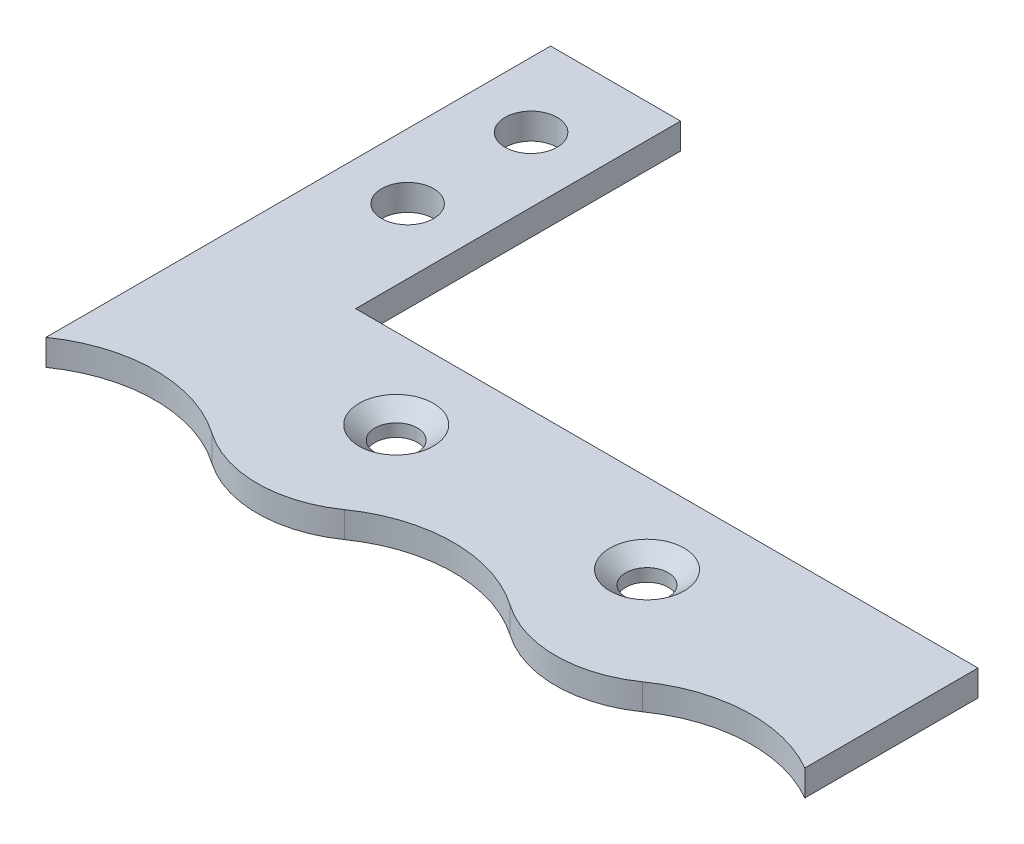
ISO-10303-21;
HEADER;
FILE_DESCRIPTION(('STEP AP214'),'2;1');
FILE_NAME('part.step','',(''),(''),'','','');
FILE_SCHEMA(('AUTOMOTIVE_DESIGN { 1 0 10303 214 1 1 1 1 }'));
ENDSEC;
DATA;
#1=APPLICATION_CONTEXT('core data for automotive mechanical design processes');
#2=APPLICATION_PROTOCOL_DEFINITION('international standard','automotive_design',2000,#1);
#3=PRODUCT_CONTEXT('',#1,'mechanical');
#4=PRODUCT('Part','Part','',(#3));
#5=PRODUCT_RELATED_PRODUCT_CATEGORY('part','',(#4));
#6=PRODUCT_DEFINITION_FORMATION('','',#4);
#7=PRODUCT_DEFINITION_CONTEXT('part definition',#1,'design');
#8=PRODUCT_DEFINITION('design','',#6,#7);
#9=PRODUCT_DEFINITION_SHAPE('','',#8);
#10=(LENGTH_UNIT() NAMED_UNIT(*) SI_UNIT(.MILLI.,.METRE.));
#11=(NAMED_UNIT(*) PLANE_ANGLE_UNIT() SI_UNIT($,.RADIAN.));
#12=(NAMED_UNIT(*) SI_UNIT($,.STERADIAN.) SOLID_ANGLE_UNIT());
#13=UNCERTAINTY_MEASURE_WITH_UNIT(LENGTH_MEASURE(1.E-05),#10,'distance_accuracy_value','');
#14=(GEOMETRIC_REPRESENTATION_CONTEXT(3) GLOBAL_UNCERTAINTY_ASSIGNED_CONTEXT((#13)) GLOBAL_UNIT_ASSIGNED_CONTEXT((#10,
#11,#12)) REPRESENTATION_CONTEXT('',''));
#15=CARTESIAN_POINT('',(0.,0.,0.));
#16=DIRECTION('',(0.,0.,1.));
#17=DIRECTION('',(1.,0.,0.));
#18=AXIS2_PLACEMENT_3D('',#15,#16,#17);
#19=CARTESIAN_POINT('',(-22.95,1.,0.));
#20=DIRECTION('',(0.,-1.,0.));
#21=DIRECTION('',(0.,0.,-1.));
#22=AXIS2_PLACEMENT_3D('',#19,#20,#21);
#23=PLANE('',#22);
#24=CARTESIAN_POINT('',(9.25666666666667,1.,-16.7627844561292));
#25=DIRECTION('',(0.,-1.,0.));
#26=DIRECTION('',(0.,0.,-1.));
#27=AXIS2_PLACEMENT_3D('',#24,#25,#26);
#28=CIRCLE('',#27,1.63195);
#29=CARTESIAN_POINT('',(9.25666666666667,1.,-18.3947344561292));
#30=VERTEX_POINT('',#29);
#31=EDGE_CURVE('E379',#30,#30,#28,.F.);
#32=ORIENTED_EDGE('',*,*,#31,.T.);
#33=EDGE_LOOP('',(#32));
#34=FACE_BOUND('',#33,.T.);
#35=CARTESIAN_POINT('',(-24.33,1.,-41.4327844561292));
#36=DIRECTION('',(0.,-1.,0.));
#37=DIRECTION('',(0.,0.,-1.));
#38=AXIS2_PLACEMENT_3D('',#35,#36,#37);
#39=CIRCLE('',#38,2.00000000000001);
#40=CARTESIAN_POINT('',(-24.33,1.,-43.4327844561293));
#41=VERTEX_POINT('',#40);
#42=EDGE_CURVE('E118',#41,#41,#39,.F.);
#43=ORIENTED_EDGE('',*,*,#42,.T.);
#44=EDGE_LOOP('',(#43));
#45=FACE_BOUND('',#44,.T.);
#46=CARTESIAN_POINT('',(-24.33,1.,-31.9327844561292));
#47=DIRECTION('',(0.,-1.,0.));
#48=DIRECTION('',(0.,0.,-1.));
#49=AXIS2_PLACEMENT_3D('',#46,#47,#48);
#50=CIRCLE('',#49,2.00000000000001);
#51=CARTESIAN_POINT('',(-24.33,1.,-33.9327844561292));
#52=VERTEX_POINT('',#51);
#53=EDGE_CURVE('E378',#52,#52,#50,.F.);
#54=ORIENTED_EDGE('',*,*,#53,.T.);
#55=EDGE_LOOP('',(#54));
#56=FACE_BOUND('',#55,.T.);
#57=CARTESIAN_POINT('',(-22.95,1.,0.));
#58=DIRECTION('',(0.,-1.,0.));
#59=DIRECTION('',(0.,0.,-1.));
#60=AXIS2_PLACEMENT_3D('',#57,#58,#59);
#61=CIRCLE('',#60,11.125);
#62=CARTESIAN_POINT('',(-29.33,1.,-9.11379311812595));
#63=VERTEX_POINT('',#62);
#64=CARTESIAN_POINT('',(-16.57,1.,-9.11379311812595));
#65=VERTEX_POINT('',#64);
#66=EDGE_CURVE('E113',#63,#65,#61,.T.);
#67=ORIENTED_EDGE('',*,*,#66,.F.);
#68=DIRECTION('',(0.,0.,-1.));
#69=VECTOR('',#68,1.);
#70=CARTESIAN_POINT('',(-29.33,1.,0.));
#71=LINE('',#70,#69);
#72=CARTESIAN_POINT('',(-29.33,1.,-47.9327844561292));
#73=VERTEX_POINT('',#72);
#74=EDGE_CURVE('E126',#73,#63,#71,.F.);
#75=ORIENTED_EDGE('',*,*,#74,.F.);
#76=DIRECTION('',(1.,0.,0.));
#77=VECTOR('',#76,1.);
#78=CARTESIAN_POINT('',(-22.95,1.,-47.9327844561292));
#79=LINE('',#78,#77);
#80=CARTESIAN_POINT('',(-19.33,1.,-47.9327844561292));
#81=VERTEX_POINT('',#80);
#82=EDGE_CURVE('E129',#81,#73,#79,.F.);
#83=ORIENTED_EDGE('',*,*,#82,.F.);
#84=DIRECTION('',(0.,0.,-1.));
#85=VECTOR('',#84,1.);
#86=CARTESIAN_POINT('',(-19.33,1.,0.));
#87=LINE('',#86,#85);
#88=CARTESIAN_POINT('',(-19.33,1.,-22.9327844561292));
#89=VERTEX_POINT('',#88);
#90=EDGE_CURVE('E132',#89,#81,#87,.T.);
#91=ORIENTED_EDGE('',*,*,#90,.F.);
#92=DIRECTION('',(1.,0.,0.));
#93=VECTOR('',#92,1.);
#94=CARTESIAN_POINT('',(-22.95,1.,-22.9327844561292));
#95=LINE('',#94,#93);
#96=CARTESIAN_POINT('',(28.55,1.,-22.9327844561292));
#97=VERTEX_POINT('',#96);
#98=EDGE_CURVE('E135',#97,#89,#95,.F.);
#99=ORIENTED_EDGE('',*,*,#98,.F.);
#100=DIRECTION('',(0.,0.,-1.));
#101=VECTOR('',#100,1.);
#102=CARTESIAN_POINT('',(28.55,1.,0.));
#103=LINE('',#102,#101);
#104=CARTESIAN_POINT('',(28.55,1.,-9.61278445612924));
#105=VERTEX_POINT('',#104);
#106=EDGE_CURVE('E138',#105,#97,#103,.T.);
#107=ORIENTED_EDGE('',*,*,#106,.F.);
#108=CARTESIAN_POINT('',(22.95,1.,0.));
#109=DIRECTION('',(0.,-1.,0.));
#110=DIRECTION('',(0.,0.,-1.));
#111=AXIS2_PLACEMENT_3D('',#108,#109,#110);
#112=CIRCLE('',#111,11.125);
#113=CARTESIAN_POINT('',(16.57,1.,-9.11379311812595));
#114=VERTEX_POINT('',#113);
#115=EDGE_CURVE('E141',#114,#105,#112,.T.);
#116=ORIENTED_EDGE('',*,*,#115,.F.);
#117=CARTESIAN_POINT('',(11.475,1.,-16.3919711646544));
#118=DIRECTION('',(0.,1.,0.));
#119=DIRECTION('',(0.,0.,1.));
#120=AXIS2_PLACEMENT_3D('',#117,#118,#119);
#121=CIRCLE('',#120,8.88430642633228);
#122=CARTESIAN_POINT('',(6.38,1.,-9.11379311812595));
#123=VERTEX_POINT('',#122);
#124=EDGE_CURVE('E144',#123,#114,#121,.T.);
#125=ORIENTED_EDGE('',*,*,#124,.F.);
#126=CARTESIAN_POINT('',(0.,1.,0.));
#127=DIRECTION('',(0.,-1.,0.));
#128=DIRECTION('',(0.,0.,-1.));
#129=AXIS2_PLACEMENT_3D('',#126,#127,#128);
#130=CIRCLE('',#129,11.125);
#131=CARTESIAN_POINT('',(-6.38,1.,-9.11379311812595));
#132=VERTEX_POINT('',#131);
#133=EDGE_CURVE('E115',#132,#123,#130,.T.);
#134=ORIENTED_EDGE('',*,*,#133,.F.);
#135=CARTESIAN_POINT('',(-11.475,1.,-16.3919711646544));
#136=DIRECTION('',(0.,1.,0.));
#137=DIRECTION('',(0.,0.,1.));
#138=AXIS2_PLACEMENT_3D('',#135,#136,#137);
#139=CIRCLE('',#138,8.88430642633228);
#140=EDGE_CURVE('E102',#65,#132,#139,.T.);
#141=ORIENTED_EDGE('',*,*,#140,.F.);
#142=EDGE_LOOP('',(#67,#75,#83,#91,#99,#107,#116,#125,#134,#141));
#143=FACE_BOUND('',#142,.T.);
#144=CARTESIAN_POINT('',(-10.0366666666667,1.,-16.7627844561292));
#145=DIRECTION('',(0.,-1.,0.));
#146=DIRECTION('',(0.,0.,-1.));
#147=AXIS2_PLACEMENT_3D('',#144,#145,#146);
#148=CIRCLE('',#147,1.63195);
#149=CARTESIAN_POINT('',(-10.0366666666667,1.,-18.3947344561292));
#150=VERTEX_POINT('',#149);
#151=EDGE_CURVE('E369',#150,#150,#148,.F.);
#152=ORIENTED_EDGE('',*,*,#151,.T.);
#153=EDGE_LOOP('',(#152));
#154=FACE_BOUND('',#153,.T.);
#155=ADVANCED_FACE('F42',(#34,#45,#56,#143,#154),#23,.T.);
#156=CARTESIAN_POINT('',(-22.95,3.,0.));
#157=DIRECTION('',(0.,-1.,0.));
#158=DIRECTION('',(0.,0.,-1.));
#159=AXIS2_PLACEMENT_3D('',#156,#157,#158);
#160=PLANE('',#159);
#161=CARTESIAN_POINT('',(-10.0366666666667,3.,-16.7627844561292));
#162=DIRECTION('',(0.,1.,0.));
#163=DIRECTION('',(0.,0.,1.));
#164=AXIS2_PLACEMENT_3D('',#161,#162,#163);
#165=CIRCLE('',#164,2.8575);
#166=CARTESIAN_POINT('',(-10.0366666666667,3.,-13.9052844561292));
#167=VERTEX_POINT('',#166);
#168=EDGE_CURVE('E368',#167,#167,#165,.T.);
#169=ORIENTED_EDGE('',*,*,#168,.F.);
#170=EDGE_LOOP('',(#169));
#171=FACE_BOUND('',#170,.T.);
#172=CARTESIAN_POINT('',(-24.33,3.,-41.4327844561292));
#173=DIRECTION('',(0.,1.,0.));
#174=DIRECTION('',(0.,0.,1.));
#175=AXIS2_PLACEMENT_3D('',#172,#173,#174);
#176=CIRCLE('',#175,2.00000000000001);
#177=CARTESIAN_POINT('',(-24.33,3.,-39.4327844561292));
#178=VERTEX_POINT('',#177);
#179=EDGE_CURVE('E121',#178,#178,#176,.T.);
#180=ORIENTED_EDGE('',*,*,#179,.F.);
#181=EDGE_LOOP('',(#180));
#182=FACE_BOUND('',#181,.T.);
#183=CARTESIAN_POINT('',(-24.33,3.,-31.9327844561292));
#184=DIRECTION('',(0.,1.,0.));
#185=DIRECTION('',(0.,0.,1.));
#186=AXIS2_PLACEMENT_3D('',#183,#184,#185);
#187=CIRCLE('',#186,2.00000000000001);
#188=CARTESIAN_POINT('',(-24.33,3.,-29.9327844561292));
#189=VERTEX_POINT('',#188);
#190=EDGE_CURVE('E385',#189,#189,#187,.T.);
#191=ORIENTED_EDGE('',*,*,#190,.F.);
#192=EDGE_LOOP('',(#191));
#193=FACE_BOUND('',#192,.T.);
#194=CARTESIAN_POINT('',(-22.95,3.,0.));
#195=DIRECTION('',(0.,-1.,0.));
#196=DIRECTION('',(0.,0.,-1.));
#197=AXIS2_PLACEMENT_3D('',#194,#195,#196);
#198=CIRCLE('',#197,11.125);
#199=CARTESIAN_POINT('',(-29.33,3.,-9.11379311812595));
#200=VERTEX_POINT('',#199);
#201=CARTESIAN_POINT('',(-16.57,3.,-9.11379311812595));
#202=VERTEX_POINT('',#201);
#203=EDGE_CURVE('E128',#200,#202,#198,.T.);
#204=ORIENTED_EDGE('',*,*,#203,.T.);
#205=CARTESIAN_POINT('',(-11.475,3.,-16.3919711646544));
#206=DIRECTION('',(0.,1.,0.));
#207=DIRECTION('',(0.,0.,-1.));
#208=AXIS2_PLACEMENT_3D('',#205,#206,#207);
#209=CIRCLE('',#208,8.88430642633228);
#210=CARTESIAN_POINT('',(-6.38,3.,-9.11379311812595));
#211=VERTEX_POINT('',#210);
#212=EDGE_CURVE('E104',#202,#211,#209,.T.);
#213=ORIENTED_EDGE('',*,*,#212,.T.);
#214=CARTESIAN_POINT('',(0.,3.,0.));
#215=DIRECTION('',(0.,-1.,0.));
#216=DIRECTION('',(0.,0.,-1.));
#217=AXIS2_PLACEMENT_3D('',#214,#215,#216);
#218=CIRCLE('',#217,11.125);
#219=CARTESIAN_POINT('',(6.38,3.,-9.11379311812595));
#220=VERTEX_POINT('',#219);
#221=EDGE_CURVE('E171',#211,#220,#218,.T.);
#222=ORIENTED_EDGE('',*,*,#221,.T.);
#223=CARTESIAN_POINT('',(11.475,3.,-16.3919711646544));
#224=DIRECTION('',(0.,1.,0.));
#225=DIRECTION('',(0.,0.,-1.));
#226=AXIS2_PLACEMENT_3D('',#223,#224,#225);
#227=CIRCLE('',#226,8.88430642633228);
#228=CARTESIAN_POINT('',(16.57,3.,-9.11379311812595));
#229=VERTEX_POINT('',#228);
#230=EDGE_CURVE('E181',#220,#229,#227,.T.);
#231=ORIENTED_EDGE('',*,*,#230,.T.);
#232=CARTESIAN_POINT('',(22.95,3.,0.));
#233=DIRECTION('',(0.,-1.,0.));
#234=DIRECTION('',(0.,0.,-1.));
#235=AXIS2_PLACEMENT_3D('',#232,#233,#234);
#236=CIRCLE('',#235,11.125);
#237=CARTESIAN_POINT('',(28.55,3.,-9.61278445612924));
#238=VERTEX_POINT('',#237);
#239=EDGE_CURVE('E185',#229,#238,#236,.T.);
#240=ORIENTED_EDGE('',*,*,#239,.T.);
#241=DIRECTION('',(0.,0.,-1.));
#242=VECTOR('',#241,1.);
#243=CARTESIAN_POINT('',(28.55,3.,-22.9327844561292));
#244=LINE('',#243,#242);
#245=CARTESIAN_POINT('',(28.55,3.,-22.9327844561292));
#246=VERTEX_POINT('',#245);
#247=EDGE_CURVE('E187',#238,#246,#244,.T.);
#248=ORIENTED_EDGE('',*,*,#247,.T.);
#249=DIRECTION('',(-1.,0.,0.));
#250=VECTOR('',#249,1.);
#251=CARTESIAN_POINT('',(-19.33,3.,-22.9327844561292));
#252=LINE('',#251,#250);
#253=CARTESIAN_POINT('',(-19.33,3.,-22.9327844561292));
#254=VERTEX_POINT('',#253);
#255=EDGE_CURVE('E193',#246,#254,#252,.T.);
#256=ORIENTED_EDGE('',*,*,#255,.T.);
#257=DIRECTION('',(0.,0.,-1.));
#258=VECTOR('',#257,1.);
#259=CARTESIAN_POINT('',(-19.33,3.,-47.9327844561292));
#260=LINE('',#259,#258);
#261=CARTESIAN_POINT('',(-19.33,3.,-47.9327844561292));
#262=VERTEX_POINT('',#261);
#263=EDGE_CURVE('E196',#254,#262,#260,.T.);
#264=ORIENTED_EDGE('',*,*,#263,.T.);
#265=DIRECTION('',(-1.,0.,0.));
#266=VECTOR('',#265,1.);
#267=CARTESIAN_POINT('',(-29.33,3.,-47.9327844561292));
#268=LINE('',#267,#266);
#269=CARTESIAN_POINT('',(-29.33,3.,-47.9327844561292));
#270=VERTEX_POINT('',#269);
#271=EDGE_CURVE('E198',#262,#270,#268,.T.);
#272=ORIENTED_EDGE('',*,*,#271,.T.);
#273=DIRECTION('',(0.,0.,1.));
#274=VECTOR('',#273,1.);
#275=CARTESIAN_POINT('',(-29.33,3.,-22.9327844561292));
#276=LINE('',#275,#274);
#277=EDGE_CURVE('E108',#270,#200,#276,.T.);
#278=ORIENTED_EDGE('',*,*,#277,.T.);
#279=EDGE_LOOP('',(#204,#213,#222,#231,#240,#248,#256,#264,#272,#278));
#280=FACE_BOUND('',#279,.T.);
#281=CARTESIAN_POINT('',(9.25666666666667,3.,-16.7627844561292));
#282=DIRECTION('',(0.,1.,0.));
#283=DIRECTION('',(0.,0.,1.));
#284=AXIS2_PLACEMENT_3D('',#281,#282,#283);
#285=CIRCLE('',#284,2.8575);
#286=CARTESIAN_POINT('',(9.25666666666667,3.,-13.9052844561292));
#287=VERTEX_POINT('',#286);
#288=EDGE_CURVE('E380',#287,#287,#285,.T.);
#289=ORIENTED_EDGE('',*,*,#288,.F.);
#290=EDGE_LOOP('',(#289));
#291=FACE_BOUND('',#290,.T.);
#292=ADVANCED_FACE('F178',(#171,#182,#193,#280,#291),#160,.F.);
#293=CARTESIAN_POINT('',(0.,3.,0.));
#294=DIRECTION('',(0.,-1.,0.));
#295=DIRECTION('',(0.,0.,-1.));
#296=AXIS2_PLACEMENT_3D('',#293,#294,#295);
#297=CYLINDRICAL_SURFACE('',#296,11.125);
#298=DIRECTION('',(0.,1.,0.));
#299=VECTOR('',#298,1.);
#300=CARTESIAN_POINT('',(-6.38,3.,-9.11379311812595));
#301=LINE('',#300,#299);
#302=EDGE_CURVE('E11',#132,#211,#301,.T.);
#303=ORIENTED_EDGE('',*,*,#302,.F.);
#304=ORIENTED_EDGE('',*,*,#133,.T.);
#305=DIRECTION('',(0.,1.,0.));
#306=VECTOR('',#305,1.);
#307=CARTESIAN_POINT('',(6.38,3.,-9.11379311812595));
#308=LINE('',#307,#306);
#309=EDGE_CURVE('E52',#123,#220,#308,.T.);
#310=ORIENTED_EDGE('',*,*,#309,.T.);
#311=ORIENTED_EDGE('',*,*,#221,.F.);
#312=EDGE_LOOP('',(#303,#304,#310,#311));
#313=FACE_BOUND('',#312,.T.);
#314=ADVANCED_FACE('F169',(#313),#297,.F.);
#315=CARTESIAN_POINT('',(11.475,3.,-16.3919711646544));
#316=DIRECTION('',(0.,-1.,0.));
#317=DIRECTION('',(0.,0.,-1.));
#318=AXIS2_PLACEMENT_3D('',#315,#316,#317);
#319=CYLINDRICAL_SURFACE('',#318,8.88430642633228);
#320=ORIENTED_EDGE('',*,*,#309,.F.);
#321=ORIENTED_EDGE('',*,*,#124,.T.);
#322=DIRECTION('',(0.,1.,0.));
#323=VECTOR('',#322,1.);
#324=CARTESIAN_POINT('',(16.57,3.,-9.11379311812595));
#325=LINE('',#324,#323);
#326=EDGE_CURVE('E163',#114,#229,#325,.T.);
#327=ORIENTED_EDGE('',*,*,#326,.T.);
#328=ORIENTED_EDGE('',*,*,#230,.F.);
#329=EDGE_LOOP('',(#320,#321,#327,#328));
#330=FACE_BOUND('',#329,.T.);
#331=ADVANCED_FACE('F184',(#330),#319,.T.);
#332=CARTESIAN_POINT('',(22.95,3.,0.));
#333=DIRECTION('',(0.,-1.,0.));
#334=DIRECTION('',(0.,0.,-1.));
#335=AXIS2_PLACEMENT_3D('',#332,#333,#334);
#336=CYLINDRICAL_SURFACE('',#335,11.125);
#337=ORIENTED_EDGE('',*,*,#326,.F.);
#338=ORIENTED_EDGE('',*,*,#115,.T.);
#339=DIRECTION('',(0.,1.,0.));
#340=VECTOR('',#339,1.);
#341=CARTESIAN_POINT('',(28.55,3.,-9.61278445612924));
#342=LINE('',#341,#340);
#343=EDGE_CURVE('E160',#105,#238,#342,.T.);
#344=ORIENTED_EDGE('',*,*,#343,.T.);
#345=ORIENTED_EDGE('',*,*,#239,.F.);
#346=EDGE_LOOP('',(#337,#338,#344,#345));
#347=FACE_BOUND('',#346,.T.);
#348=ADVANCED_FACE('F228',(#347),#336,.F.);
#349=CARTESIAN_POINT('',(28.55,3.,-22.9327844561292));
#350=DIRECTION('',(-1.,0.,0.));
#351=DIRECTION('',(0.,0.,-1.));
#352=AXIS2_PLACEMENT_3D('',#349,#350,#351);
#353=PLANE('',#352);
#354=ORIENTED_EDGE('',*,*,#343,.F.);
#355=ORIENTED_EDGE('',*,*,#106,.T.);
#356=DIRECTION('',(0.,1.,0.));
#357=VECTOR('',#356,1.);
#358=CARTESIAN_POINT('',(28.55,3.,-22.9327844561292));
#359=LINE('',#358,#357);
#360=EDGE_CURVE('E157',#97,#246,#359,.T.);
#361=ORIENTED_EDGE('',*,*,#360,.T.);
#362=ORIENTED_EDGE('',*,*,#247,.F.);
#363=EDGE_LOOP('',(#354,#355,#361,#362));
#364=FACE_BOUND('',#363,.T.);
#365=ADVANCED_FACE('F221',(#364),#353,.F.);
#366=CARTESIAN_POINT('',(-19.33,3.,-22.9327844561292));
#367=DIRECTION('',(0.,0.,1.));
#368=DIRECTION('',(-1.,0.,0.));
#369=AXIS2_PLACEMENT_3D('',#366,#367,#368);
#370=PLANE('',#369);
#371=ORIENTED_EDGE('',*,*,#360,.F.);
#372=ORIENTED_EDGE('',*,*,#98,.T.);
#373=DIRECTION('',(0.,1.,0.));
#374=VECTOR('',#373,1.);
#375=CARTESIAN_POINT('',(-19.33,3.,-22.9327844561292));
#376=LINE('',#375,#374);
#377=EDGE_CURVE('E154',#89,#254,#376,.T.);
#378=ORIENTED_EDGE('',*,*,#377,.T.);
#379=ORIENTED_EDGE('',*,*,#255,.F.);
#380=EDGE_LOOP('',(#371,#372,#378,#379));
#381=FACE_BOUND('',#380,.T.);
#382=ADVANCED_FACE('F214',(#381),#370,.F.);
#383=CARTESIAN_POINT('',(-19.33,3.,-47.9327844561292));
#384=DIRECTION('',(-1.,0.,0.));
#385=DIRECTION('',(0.,0.,-1.));
#386=AXIS2_PLACEMENT_3D('',#383,#384,#385);
#387=PLANE('',#386);
#388=ORIENTED_EDGE('',*,*,#377,.F.);
#389=ORIENTED_EDGE('',*,*,#90,.T.);
#390=DIRECTION('',(0.,1.,0.));
#391=VECTOR('',#390,1.);
#392=CARTESIAN_POINT('',(-19.33,3.,-47.9327844561292));
#393=LINE('',#392,#391);
#394=EDGE_CURVE('E151',#81,#262,#393,.T.);
#395=ORIENTED_EDGE('',*,*,#394,.T.);
#396=ORIENTED_EDGE('',*,*,#263,.F.);
#397=EDGE_LOOP('',(#388,#389,#395,#396));
#398=FACE_BOUND('',#397,.T.);
#399=ADVANCED_FACE('F209',(#398),#387,.F.);
#400=CARTESIAN_POINT('',(-29.33,3.,-47.9327844561292));
#401=DIRECTION('',(0.,0.,1.));
#402=DIRECTION('',(-1.,0.,0.));
#403=AXIS2_PLACEMENT_3D('',#400,#401,#402);
#404=PLANE('',#403);
#405=ORIENTED_EDGE('',*,*,#394,.F.);
#406=ORIENTED_EDGE('',*,*,#82,.T.);
#407=DIRECTION('',(0.,1.,0.));
#408=VECTOR('',#407,1.);
#409=CARTESIAN_POINT('',(-29.33,3.,-47.9327844561292));
#410=LINE('',#409,#408);
#411=EDGE_CURVE('E149',#73,#270,#410,.T.);
#412=ORIENTED_EDGE('',*,*,#411,.T.);
#413=ORIENTED_EDGE('',*,*,#271,.F.);
#414=EDGE_LOOP('',(#405,#406,#412,#413));
#415=FACE_BOUND('',#414,.T.);
#416=ADVANCED_FACE('F205',(#415),#404,.F.);
#417=CARTESIAN_POINT('',(-29.33,3.,-22.9327844561292));
#418=DIRECTION('',(1.,0.,0.));
#419=DIRECTION('',(0.,0.,1.));
#420=AXIS2_PLACEMENT_3D('',#417,#418,#419);
#421=PLANE('',#420);
#422=ORIENTED_EDGE('',*,*,#411,.F.);
#423=ORIENTED_EDGE('',*,*,#74,.T.);
#424=DIRECTION('',(0.,1.,0.));
#425=VECTOR('',#424,1.);
#426=CARTESIAN_POINT('',(-29.33,3.,-9.11379311812595));
#427=LINE('',#426,#425);
#428=EDGE_CURVE('E60',#63,#200,#427,.T.);
#429=ORIENTED_EDGE('',*,*,#428,.T.);
#430=ORIENTED_EDGE('',*,*,#277,.F.);
#431=EDGE_LOOP('',(#422,#423,#429,#430));
#432=FACE_BOUND('',#431,.T.);
#433=ADVANCED_FACE('F202',(#432),#421,.F.);
#434=CARTESIAN_POINT('',(-22.95,3.,0.));
#435=DIRECTION('',(0.,-1.,0.));
#436=DIRECTION('',(0.,0.,-1.));
#437=AXIS2_PLACEMENT_3D('',#434,#435,#436);
#438=CYLINDRICAL_SURFACE('',#437,11.125);
#439=ORIENTED_EDGE('',*,*,#428,.F.);
#440=ORIENTED_EDGE('',*,*,#66,.T.);
#441=DIRECTION('',(0.,1.,0.));
#442=VECTOR('',#441,1.);
#443=CARTESIAN_POINT('',(-16.57,3.,-9.11379311812595));
#444=LINE('',#443,#442);
#445=EDGE_CURVE('E46',#65,#202,#444,.T.);
#446=ORIENTED_EDGE('',*,*,#445,.T.);
#447=ORIENTED_EDGE('',*,*,#203,.F.);
#448=EDGE_LOOP('',(#439,#440,#446,#447));
#449=FACE_BOUND('',#448,.T.);
#450=ADVANCED_FACE('F117',(#449),#438,.F.);
#451=CARTESIAN_POINT('',(-11.475,3.,-16.3919711646544));
#452=DIRECTION('',(0.,-1.,0.));
#453=DIRECTION('',(0.,0.,-1.));
#454=AXIS2_PLACEMENT_3D('',#451,#452,#453);
#455=CYLINDRICAL_SURFACE('',#454,8.88430642633228);
#456=ORIENTED_EDGE('',*,*,#140,.T.);
#457=ORIENTED_EDGE('',*,*,#302,.T.);
#458=ORIENTED_EDGE('',*,*,#212,.F.);
#459=ORIENTED_EDGE('',*,*,#445,.F.);
#460=EDGE_LOOP('',(#456,#457,#458,#459));
#461=FACE_BOUND('',#460,.T.);
#462=ADVANCED_FACE('F44',(#461),#455,.T.);
#463=CARTESIAN_POINT('',(-24.33,-4.6568542494924,-31.9327844561292));
#464=DIRECTION('',(0.,1.,0.));
#465=DIRECTION('',(0.,0.,1.));
#466=AXIS2_PLACEMENT_3D('',#463,#464,#465);
#467=CYLINDRICAL_SURFACE('',#466,2.00000000000001);
#468=ORIENTED_EDGE('',*,*,#190,.T.);
#469=EDGE_LOOP('',(#468));
#470=FACE_BOUND('',#469,.T.);
#471=ORIENTED_EDGE('',*,*,#53,.F.);
#472=EDGE_LOOP('',(#471));
#473=FACE_BOUND('',#472,.T.);
#474=ADVANCED_FACE('F291',(#470,#473),#467,.F.);
#475=CARTESIAN_POINT('',(-24.33,-4.6568542494924,-41.4327844561292));
#476=DIRECTION('',(0.,1.,0.));
#477=DIRECTION('',(0.,0.,1.));
#478=AXIS2_PLACEMENT_3D('',#475,#476,#477);
#479=CYLINDRICAL_SURFACE('',#478,2.00000000000001);
#480=ORIENTED_EDGE('',*,*,#179,.T.);
#481=EDGE_LOOP('',(#480));
#482=FACE_BOUND('',#481,.T.);
#483=ORIENTED_EDGE('',*,*,#42,.F.);
#484=EDGE_LOOP('',(#483));
#485=FACE_BOUND('',#484,.T.);
#486=ADVANCED_FACE('F297',(#482,#485),#479,.F.);
#487=CARTESIAN_POINT('',(9.25666666666667,3.,-16.7627844561292));
#488=DIRECTION('',(0.,1.,0.));
#489=DIRECTION('',(0.,0.,1.));
#490=AXIS2_PLACEMENT_3D('',#487,#488,#489);
#491=CYLINDRICAL_SURFACE('',#490,1.63195);
#492=ORIENTED_EDGE('',*,*,#31,.F.);
#493=EDGE_LOOP('',(#492));
#494=FACE_BOUND('',#493,.T.);
#495=CARTESIAN_POINT('',(9.25666666666667,1.97164144701069,-16.7627844561292));
#496=DIRECTION('',(0.,1.,0.));
#497=DIRECTION('',(0.,0.,1.));
#498=AXIS2_PLACEMENT_3D('',#495,#496,#497);
#499=CIRCLE('',#498,1.63195);
#500=CARTESIAN_POINT('',(9.25666666666667,1.97164144701069,-15.1308344561292));
#501=VERTEX_POINT('',#500);
#502=EDGE_CURVE('E375',#501,#501,#499,.T.);
#503=ORIENTED_EDGE('',*,*,#502,.T.);
#504=EDGE_LOOP('',(#503));
#505=FACE_BOUND('',#504,.T.);
#506=ADVANCED_FACE('F304',(#494,#505),#491,.F.);
#507=CARTESIAN_POINT('',(9.25666666666667,3.,-16.7627844561292));
#508=DIRECTION('',(0.,1.,0.));
#509=DIRECTION('',(0.,0.,1.));
#510=AXIS2_PLACEMENT_3D('',#507,#508,#509);
#511=CONICAL_SURFACE('',#510,2.8575,0.872664625997165);
#512=ORIENTED_EDGE('',*,*,#502,.F.);
#513=EDGE_LOOP('',(#512));
#514=FACE_BOUND('',#513,.T.);
#515=ORIENTED_EDGE('',*,*,#288,.T.);
#516=EDGE_LOOP('',(#515));
#517=FACE_BOUND('',#516,.T.);
#518=ADVANCED_FACE('F329',(#514,#517),#511,.F.);
#519=CARTESIAN_POINT('',(-10.0366666666667,3.,-16.7627844561292));
#520=DIRECTION('',(0.,1.,0.));
#521=DIRECTION('',(0.,0.,1.));
#522=AXIS2_PLACEMENT_3D('',#519,#520,#521);
#523=CYLINDRICAL_SURFACE('',#522,1.63195);
#524=ORIENTED_EDGE('',*,*,#151,.F.);
#525=EDGE_LOOP('',(#524));
#526=FACE_BOUND('',#525,.T.);
#527=CARTESIAN_POINT('',(-10.0366666666667,1.97164144701069,-16.7627844561292));
#528=DIRECTION('',(0.,1.,0.));
#529=DIRECTION('',(0.,0.,1.));
#530=AXIS2_PLACEMENT_3D('',#527,#528,#529);
#531=CIRCLE('',#530,1.63195);
#532=CARTESIAN_POINT('',(-10.0366666666667,1.97164144701069,-15.1308344561292));
#533=VERTEX_POINT('',#532);
#534=EDGE_CURVE('E365',#533,#533,#531,.T.);
#535=ORIENTED_EDGE('',*,*,#534,.T.);
#536=EDGE_LOOP('',(#535));
#537=FACE_BOUND('',#536,.T.);
#538=ADVANCED_FACE('F339',(#526,#537),#523,.F.);
#539=CARTESIAN_POINT('',(-10.0366666666667,3.,-16.7627844561292));
#540=DIRECTION('',(0.,1.,0.));
#541=DIRECTION('',(0.,0.,1.));
#542=AXIS2_PLACEMENT_3D('',#539,#540,#541);
#543=CONICAL_SURFACE('',#542,2.8575,0.872664625997165);
#544=ORIENTED_EDGE('',*,*,#534,.F.);
#545=EDGE_LOOP('',(#544));
#546=FACE_BOUND('',#545,.T.);
#547=ORIENTED_EDGE('',*,*,#168,.T.);
#548=EDGE_LOOP('',(#547));
#549=FACE_BOUND('',#548,.T.);
#550=ADVANCED_FACE('F349',(#546,#549),#543,.F.);
#551=CLOSED_SHELL('',(#155,#292,#314,#331,#348,#365,#382,#399,#416,#433,#450,#462,#474,#486,
#506,#518,#538,#550));
#552=MANIFOLD_SOLID_BREP('B2',#551);
#553=ADVANCED_BREP_SHAPE_REPRESENTATION('',(#18,#552),#14);
#554=SHAPE_DEFINITION_REPRESENTATION(#9,#553);
ENDSEC;
END-ISO-10303-21;
